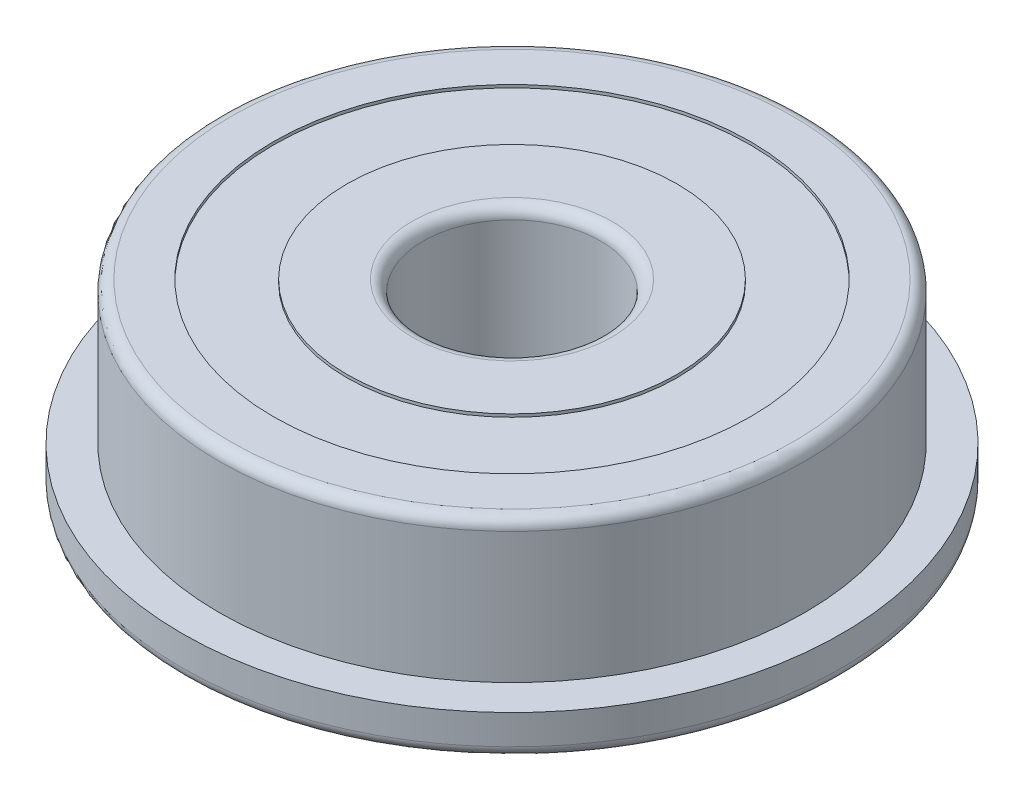
ISO-10303-21;
HEADER;
FILE_DESCRIPTION(('STEP AP214'),'2;1');
FILE_NAME('part.step','',(''),(''),'','','');
FILE_SCHEMA(('AUTOMOTIVE_DESIGN { 1 0 10303 214 1 1 1 1 }'));
ENDSEC;
DATA;
#1=APPLICATION_CONTEXT('core data for automotive mechanical design processes');
#2=APPLICATION_PROTOCOL_DEFINITION('international standard','automotive_design',2000,#1);
#3=PRODUCT_CONTEXT('',#1,'mechanical');
#4=PRODUCT('Part','Part','',(#3));
#5=PRODUCT_RELATED_PRODUCT_CATEGORY('part','',(#4));
#6=PRODUCT_DEFINITION_FORMATION('','',#4);
#7=PRODUCT_DEFINITION_CONTEXT('part definition',#1,'design');
#8=PRODUCT_DEFINITION('design','',#6,#7);
#9=PRODUCT_DEFINITION_SHAPE('','',#8);
#10=(LENGTH_UNIT() NAMED_UNIT(*) SI_UNIT(.MILLI.,.METRE.));
#11=(NAMED_UNIT(*) PLANE_ANGLE_UNIT() SI_UNIT($,.RADIAN.));
#12=(NAMED_UNIT(*) SI_UNIT($,.STERADIAN.) SOLID_ANGLE_UNIT());
#13=UNCERTAINTY_MEASURE_WITH_UNIT(LENGTH_MEASURE(1.E-05),#10,'distance_accuracy_value','');
#14=(GEOMETRIC_REPRESENTATION_CONTEXT(3) GLOBAL_UNCERTAINTY_ASSIGNED_CONTEXT((#13)) GLOBAL_UNIT_ASSIGNED_CONTEXT((#10,
#11,#12)) REPRESENTATION_CONTEXT('',''));
#15=CARTESIAN_POINT('',(0.,0.,0.));
#16=DIRECTION('',(0.,0.,1.));
#17=DIRECTION('',(1.,0.,0.));
#18=AXIS2_PLACEMENT_3D('',#15,#16,#17);
#19=CARTESIAN_POINT('',(0.,5.,0.));
#20=DIRECTION('',(0.,1.,0.));
#21=DIRECTION('',(0.,0.,1.));
#22=AXIS2_PLACEMENT_3D('',#19,#20,#21);
#23=PLANE('',#22);
#24=CARTESIAN_POINT('',(0.,5.,0.));
#25=DIRECTION('',(0.,1.,0.));
#26=DIRECTION('',(0.,0.,1.));
#27=AXIS2_PLACEMENT_3D('',#24,#25,#26);
#28=CIRCLE('',#27,2.73);
#29=CARTESIAN_POINT('',(0.,5.,2.73));
#30=VERTEX_POINT('',#29);
#31=EDGE_CURVE('E10',#30,#30,#28,.F.);
#32=ORIENTED_EDGE('',*,*,#31,.T.);
#33=EDGE_LOOP('',(#32));
#34=FACE_BOUND('',#33,.T.);
#35=CARTESIAN_POINT('',(0.,5.,0.));
#36=DIRECTION('',(0.,1.,0.));
#37=DIRECTION('',(0.,0.,1.));
#38=AXIS2_PLACEMENT_3D('',#35,#36,#37);
#39=CIRCLE('',#38,4.5);
#40=CARTESIAN_POINT('',(0.,5.,4.5));
#41=VERTEX_POINT('',#40);
#42=EDGE_CURVE('E94',#41,#41,#39,.T.);
#43=ORIENTED_EDGE('',*,*,#42,.T.);
#44=EDGE_LOOP('',(#43));
#45=FACE_BOUND('',#44,.T.);
#46=ADVANCED_FACE('F37',(#34,#45),#23,.T.);
#47=CARTESIAN_POINT('',(0.,0.,0.));
#48=DIRECTION('',(0.,1.,0.));
#49=DIRECTION('',(0.,0.,1.));
#50=AXIS2_PLACEMENT_3D('',#47,#48,#49);
#51=PLANE('',#50);
#52=CARTESIAN_POINT('',(0.,0.,0.));
#53=DIRECTION('',(0.,1.,0.));
#54=DIRECTION('',(0.,0.,1.));
#55=AXIS2_PLACEMENT_3D('',#52,#53,#54);
#56=CIRCLE('',#55,2.73);
#57=CARTESIAN_POINT('',(0.,0.,2.73));
#58=VERTEX_POINT('',#57);
#59=EDGE_CURVE('E66',#58,#58,#56,.T.);
#60=ORIENTED_EDGE('',*,*,#59,.T.);
#61=EDGE_LOOP('',(#60));
#62=FACE_BOUND('',#61,.T.);
#63=CARTESIAN_POINT('',(0.,0.,0.));
#64=DIRECTION('',(0.,-1.,0.));
#65=DIRECTION('',(0.,0.,-1.));
#66=AXIS2_PLACEMENT_3D('',#63,#64,#65);
#67=CIRCLE('',#66,4.5);
#68=CARTESIAN_POINT('',(0.,0.,-4.5));
#69=VERTEX_POINT('',#68);
#70=EDGE_CURVE('E82',#69,#69,#67,.T.);
#71=ORIENTED_EDGE('',*,*,#70,.T.);
#72=EDGE_LOOP('',(#71));
#73=FACE_BOUND('',#72,.T.);
#74=ADVANCED_FACE('F132',(#62,#73),#51,.F.);
#75=CARTESIAN_POINT('',(0.,1.12,0.));
#76=DIRECTION('',(0.,-1.,0.));
#77=DIRECTION('',(0.,0.,-1.));
#78=AXIS2_PLACEMENT_3D('',#75,#76,#77);
#79=CYLINDRICAL_SURFACE('',#78,8.985);
#80=CARTESIAN_POINT('',(0.,0.31,0.));
#81=DIRECTION('',(0.,1.,0.));
#82=DIRECTION('',(0.,0.,1.));
#83=AXIS2_PLACEMENT_3D('',#80,#81,#82);
#84=CIRCLE('',#83,8.985);
#85=CARTESIAN_POINT('',(0.,0.31,8.985));
#86=VERTEX_POINT('',#85);
#87=EDGE_CURVE('E57',#86,#86,#84,.T.);
#88=ORIENTED_EDGE('',*,*,#87,.T.);
#89=EDGE_LOOP('',(#88));
#90=FACE_BOUND('',#89,.T.);
#91=CARTESIAN_POINT('',(0.,1.12,0.));
#92=DIRECTION('',(0.,1.,0.));
#93=DIRECTION('',(0.,0.,1.));
#94=AXIS2_PLACEMENT_3D('',#91,#92,#93);
#95=CIRCLE('',#94,8.985);
#96=CARTESIAN_POINT('',(0.,1.12,8.985));
#97=VERTEX_POINT('',#96);
#98=EDGE_CURVE('E70',#97,#97,#95,.T.);
#99=ORIENTED_EDGE('',*,*,#98,.F.);
#100=EDGE_LOOP('',(#99));
#101=FACE_BOUND('',#100,.T.);
#102=ADVANCED_FACE('F136',(#90,#101),#79,.T.);
#103=CARTESIAN_POINT('',(0.,1.12,0.));
#104=DIRECTION('',(0.,1.,0.));
#105=DIRECTION('',(0.,0.,1.));
#106=AXIS2_PLACEMENT_3D('',#103,#104,#105);
#107=PLANE('',#106);
#108=CARTESIAN_POINT('',(0.,1.12,0.));
#109=DIRECTION('',(0.,1.,0.));
#110=DIRECTION('',(0.,0.,1.));
#111=AXIS2_PLACEMENT_3D('',#108,#109,#110);
#112=CIRCLE('',#111,7.985);
#113=CARTESIAN_POINT('',(0.,1.12,7.985));
#114=VERTEX_POINT('',#113);
#115=EDGE_CURVE('E69',#114,#114,#112,.T.);
#116=ORIENTED_EDGE('',*,*,#115,.F.);
#117=EDGE_LOOP('',(#116));
#118=FACE_BOUND('',#117,.T.);
#119=ORIENTED_EDGE('',*,*,#98,.T.);
#120=EDGE_LOOP('',(#119));
#121=FACE_BOUND('',#120,.T.);
#122=ADVANCED_FACE('F167',(#118,#121),#107,.T.);
#123=CARTESIAN_POINT('',(0.,0.,0.));
#124=DIRECTION('',(0.,1.,0.));
#125=DIRECTION('',(0.,0.,1.));
#126=AXIS2_PLACEMENT_3D('',#123,#124,#125);
#127=CIRCLE('',#126,8.675);
#128=CARTESIAN_POINT('',(0.,0.,8.675));
#129=VERTEX_POINT('',#128);
#130=EDGE_CURVE('E52',#129,#129,#127,.F.);
#131=ORIENTED_EDGE('',*,*,#130,.T.);
#132=EDGE_LOOP('',(#131));
#133=FACE_BOUND('',#132,.T.);
#134=CARTESIAN_POINT('',(0.,0.,0.));
#135=DIRECTION('',(0.,-1.,0.));
#136=DIRECTION('',(0.,0.,-1.));
#137=AXIS2_PLACEMENT_3D('',#134,#135,#136);
#138=CIRCLE('',#137,6.5);
#139=CARTESIAN_POINT('',(0.,0.,-6.5));
#140=VERTEX_POINT('',#139);
#141=EDGE_CURVE('E76',#140,#140,#138,.T.);
#142=ORIENTED_EDGE('',*,*,#141,.F.);
#143=EDGE_LOOP('',(#142));
#144=FACE_BOUND('',#143,.T.);
#145=ADVANCED_FACE('F129',(#133,#144),#51,.F.);
#146=CARTESIAN_POINT('',(0.,5.,0.));
#147=DIRECTION('',(0.,-1.,0.));
#148=DIRECTION('',(0.,0.,-1.));
#149=AXIS2_PLACEMENT_3D('',#146,#147,#148);
#150=CYLINDRICAL_SURFACE('',#149,7.985);
#151=CARTESIAN_POINT('',(0.,4.69,0.));
#152=DIRECTION('',(0.,1.,0.));
#153=DIRECTION('',(0.,0.,1.));
#154=AXIS2_PLACEMENT_3D('',#151,#152,#153);
#155=CIRCLE('',#154,7.985);
#156=CARTESIAN_POINT('',(0.,4.69,7.985));
#157=VERTEX_POINT('',#156);
#158=EDGE_CURVE('E44',#157,#157,#155,.F.);
#159=ORIENTED_EDGE('',*,*,#158,.T.);
#160=EDGE_LOOP('',(#159));
#161=FACE_BOUND('',#160,.T.);
#162=ORIENTED_EDGE('',*,*,#115,.T.);
#163=EDGE_LOOP('',(#162));
#164=FACE_BOUND('',#163,.T.);
#165=ADVANCED_FACE('F119',(#161,#164),#150,.T.);
#166=CARTESIAN_POINT('',(0.,5.,0.));
#167=DIRECTION('',(0.,1.,0.));
#168=DIRECTION('',(0.,0.,1.));
#169=AXIS2_PLACEMENT_3D('',#166,#167,#168);
#170=CIRCLE('',#169,7.675);
#171=CARTESIAN_POINT('',(0.,5.,7.675));
#172=VERTEX_POINT('',#171);
#173=EDGE_CURVE('E48',#172,#172,#170,.T.);
#174=ORIENTED_EDGE('',*,*,#173,.T.);
#175=EDGE_LOOP('',(#174));
#176=FACE_BOUND('',#175,.T.);
#177=CARTESIAN_POINT('',(0.,5.,0.));
#178=DIRECTION('',(0.,1.,0.));
#179=DIRECTION('',(0.,0.,1.));
#180=AXIS2_PLACEMENT_3D('',#177,#178,#179);
#181=CIRCLE('',#180,6.5);
#182=CARTESIAN_POINT('',(0.,5.,6.5));
#183=VERTEX_POINT('',#182);
#184=EDGE_CURVE('E88',#183,#183,#181,.T.);
#185=ORIENTED_EDGE('',*,*,#184,.F.);
#186=EDGE_LOOP('',(#185));
#187=FACE_BOUND('',#186,.T.);
#188=ADVANCED_FACE('F116',(#176,#187),#23,.T.);
#189=CARTESIAN_POINT('',(0.,0.,0.));
#190=DIRECTION('',(0.,1.,0.));
#191=DIRECTION('',(0.,0.,1.));
#192=AXIS2_PLACEMENT_3D('',#189,#190,#191);
#193=CYLINDRICAL_SURFACE('',#192,2.42);
#194=CARTESIAN_POINT('',(0.,0.31,0.));
#195=DIRECTION('',(0.,1.,0.));
#196=DIRECTION('',(0.,0.,1.));
#197=AXIS2_PLACEMENT_3D('',#194,#195,#196);
#198=CIRCLE('',#197,2.42);
#199=CARTESIAN_POINT('',(0.,0.31,2.42));
#200=VERTEX_POINT('',#199);
#201=EDGE_CURVE('E60',#200,#200,#198,.F.);
#202=ORIENTED_EDGE('',*,*,#201,.T.);
#203=EDGE_LOOP('',(#202));
#204=FACE_BOUND('',#203,.T.);
#205=CARTESIAN_POINT('',(0.,4.69,0.));
#206=DIRECTION('',(0.,1.,0.));
#207=DIRECTION('',(0.,0.,1.));
#208=AXIS2_PLACEMENT_3D('',#205,#206,#207);
#209=CIRCLE('',#208,2.42);
#210=CARTESIAN_POINT('',(0.,4.69,2.42));
#211=VERTEX_POINT('',#210);
#212=EDGE_CURVE('E63',#211,#211,#209,.T.);
#213=ORIENTED_EDGE('',*,*,#212,.T.);
#214=EDGE_LOOP('',(#213));
#215=FACE_BOUND('',#214,.T.);
#216=ADVANCED_FACE('F118',(#204,#215),#193,.F.);
#217=CARTESIAN_POINT('',(0.,0.08,0.));
#218=DIRECTION('',(0.,-1.,0.));
#219=DIRECTION('',(0.,0.,-1.));
#220=AXIS2_PLACEMENT_3D('',#217,#218,#219);
#221=CYLINDRICAL_SURFACE('',#220,6.5);
#222=CARTESIAN_POINT('',(0.,0.08,0.));
#223=DIRECTION('',(0.,-1.,0.));
#224=DIRECTION('',(0.,0.,-1.));
#225=AXIS2_PLACEMENT_3D('',#222,#223,#224);
#226=CIRCLE('',#225,6.5);
#227=CARTESIAN_POINT('',(0.,0.08,-6.5));
#228=VERTEX_POINT('',#227);
#229=EDGE_CURVE('E73',#228,#228,#226,.T.);
#230=CARTESIAN_POINT('',(0.,0.08,-6.5));
#231=CARTESIAN_POINT('',(0.,0.0791666666666667,-6.5));
#232=CARTESIAN_POINT('',(0.,0.0783333333333333,-6.5));
#233=CARTESIAN_POINT('',(0.,0.0766666666666667,-6.5));
#234=CARTESIAN_POINT('',(0.,0.0758333333333333,-6.5));
#235=CARTESIAN_POINT('',(0.,0.0741666666666667,-6.5));
#236=CARTESIAN_POINT('',(0.,0.0733333333333333,-6.5));
#237=CARTESIAN_POINT('',(0.,0.0716666666666667,-6.5));
#238=CARTESIAN_POINT('',(0.,0.0708333333333333,-6.5));
#239=CARTESIAN_POINT('',(0.,0.0691666666666667,-6.5));
#240=CARTESIAN_POINT('',(0.,0.0683333333333333,-6.5));
#241=CARTESIAN_POINT('',(0.,0.0666666666666667,-6.5));
#242=CARTESIAN_POINT('',(0.,0.0658333333333333,-6.5));
#243=CARTESIAN_POINT('',(0.,0.0641666666666667,-6.5));
#244=CARTESIAN_POINT('',(0.,0.0633333333333333,-6.5));
#245=CARTESIAN_POINT('',(0.,0.0616666666666667,-6.5));
#246=CARTESIAN_POINT('',(0.,0.0608333333333333,-6.5));
#247=CARTESIAN_POINT('',(0.,0.0591666666666667,-6.5));
#248=CARTESIAN_POINT('',(0.,0.0583333333333333,-6.5));
#249=CARTESIAN_POINT('',(0.,0.0566666666666667,-6.5));
#250=CARTESIAN_POINT('',(0.,0.0558333333333333,-6.5));
#251=CARTESIAN_POINT('',(0.,0.0541666666666667,-6.5));
#252=CARTESIAN_POINT('',(0.,0.0533333333333333,-6.5));
#253=CARTESIAN_POINT('',(0.,0.0516666666666667,-6.5));
#254=CARTESIAN_POINT('',(0.,0.0508333333333333,-6.5));
#255=CARTESIAN_POINT('',(0.,0.0491666666666667,-6.5));
#256=CARTESIAN_POINT('',(0.,0.0483333333333333,-6.5));
#257=CARTESIAN_POINT('',(0.,0.0466666666666667,-6.5));
#258=CARTESIAN_POINT('',(0.,0.0458333333333333,-6.5));
#259=CARTESIAN_POINT('',(0.,0.0441666666666667,-6.5));
#260=CARTESIAN_POINT('',(0.,0.0433333333333333,-6.5));
#261=CARTESIAN_POINT('',(0.,0.0416666666666667,-6.5));
#262=CARTESIAN_POINT('',(0.,0.0408333333333333,-6.5));
#263=CARTESIAN_POINT('',(0.,0.0391666666666667,-6.5));
#264=CARTESIAN_POINT('',(0.,0.0383333333333333,-6.5));
#265=CARTESIAN_POINT('',(0.,0.0366666666666667,-6.5));
#266=CARTESIAN_POINT('',(0.,0.0358333333333333,-6.5));
#267=CARTESIAN_POINT('',(0.,0.0341666666666667,-6.5));
#268=CARTESIAN_POINT('',(0.,0.0333333333333333,-6.5));
#269=CARTESIAN_POINT('',(0.,0.0316666666666667,-6.5));
#270=CARTESIAN_POINT('',(0.,0.0308333333333333,-6.5));
#271=CARTESIAN_POINT('',(0.,0.0291666666666667,-6.5));
#272=CARTESIAN_POINT('',(0.,0.0283333333333333,-6.5));
#273=CARTESIAN_POINT('',(0.,0.0266666666666667,-6.5));
#274=CARTESIAN_POINT('',(0.,0.0258333333333333,-6.5));
#275=CARTESIAN_POINT('',(0.,0.0241666666666667,-6.5));
#276=CARTESIAN_POINT('',(0.,0.0233333333333333,-6.5));
#277=CARTESIAN_POINT('',(0.,0.0216666666666667,-6.5));
#278=CARTESIAN_POINT('',(0.,0.0208333333333333,-6.5));
#279=CARTESIAN_POINT('',(0.,0.0191666666666667,-6.5));
#280=CARTESIAN_POINT('',(0.,0.0183333333333333,-6.5));
#281=CARTESIAN_POINT('',(0.,0.0166666666666667,-6.5));
#282=CARTESIAN_POINT('',(0.,0.0158333333333333,-6.5));
#283=CARTESIAN_POINT('',(0.,0.0141666666666667,-6.5));
#284=CARTESIAN_POINT('',(0.,0.0133333333333333,-6.5));
#285=CARTESIAN_POINT('',(0.,0.0116666666666667,-6.5));
#286=CARTESIAN_POINT('',(0.,0.0108333333333333,-6.5));
#287=CARTESIAN_POINT('',(0.,0.00916666666666667,-6.5));
#288=CARTESIAN_POINT('',(0.,0.00833333333333334,-6.5));
#289=CARTESIAN_POINT('',(0.,0.00666666666666667,-6.5));
#290=CARTESIAN_POINT('',(0.,0.00583333333333333,-6.5));
#291=CARTESIAN_POINT('',(0.,0.00416666666666667,-6.5));
#292=CARTESIAN_POINT('',(0.,0.00333333333333334,-6.5));
#293=CARTESIAN_POINT('',(0.,0.00166666666666667,-6.5));
#294=CARTESIAN_POINT('',(0.,0.000833333333333335,-6.5));
#295=CARTESIAN_POINT('',(0.,0.,-6.5));
#296=B_SPLINE_CURVE_WITH_KNOTS('',3,(#230,#231,#232,#233,#234,#235,#236,#237,#238,#239,#240,
#241,#242,#243,#244,#245,#246,#247,#248,#249,#250,#251,#252,#253,#254,#255,#256,#257,#258,#259,
#260,#261,#262,#263,#264,#265,#266,#267,#268,#269,#270,#271,#272,#273,#274,#275,#276,#277,#278,
#279,#280,#281,#282,#283,#284,#285,#286,#287,#288,#289,#290,#291,#292,#293,#294,#295),
.UNSPECIFIED.,.F.,.F.,(4,2,2,2,2,2,2,2,2,2,2,2,2,2,2,2,2,2,2,2,2,2,2,2,2,2,2,2,2,2,2,2,4),(0.,
0.00250000000000001,0.00500000000000001,0.00750000000000001,0.01,0.0125,0.015,0.0175,0.02,
0.0225,0.025,0.0275,0.03,0.0325,0.035,0.0375,0.04,0.0425,0.045,0.0475,0.05,0.0525,0.055,0.0575,
0.06,0.0625,0.065,0.0675,0.07,0.0725,0.075,0.0775,0.08),.UNSPECIFIED.);
#297=EDGE_CURVE('BSEAM126',#228,#140,#296,.T.);
#298=ORIENTED_EDGE('',*,*,#229,.F.);
#299=ORIENTED_EDGE('',*,*,#141,.T.);
#300=ORIENTED_EDGE('',*,*,#297,.T.);
#301=ORIENTED_EDGE('',*,*,#297,.F.);
#302=EDGE_LOOP('',(#298,#300,#299,#301));
#303=FACE_BOUND('',#302,.T.);
#304=ADVANCED_FACE('F126',(#303),#221,.F.);
#305=CARTESIAN_POINT('',(0.,0.08,0.));
#306=DIRECTION('',(0.,-1.,0.));
#307=DIRECTION('',(0.,0.,-1.));
#308=AXIS2_PLACEMENT_3D('',#305,#306,#307);
#309=PLANE('',#308);
#310=CARTESIAN_POINT('',(0.,0.08,0.));
#311=DIRECTION('',(0.,-1.,0.));
#312=DIRECTION('',(0.,0.,-1.));
#313=AXIS2_PLACEMENT_3D('',#310,#311,#312);
#314=CIRCLE('',#313,4.5);
#315=CARTESIAN_POINT('',(0.,0.08,-4.5));
#316=VERTEX_POINT('',#315);
#317=EDGE_CURVE('E79',#316,#316,#314,.T.);
#318=ORIENTED_EDGE('',*,*,#317,.F.);
#319=EDGE_LOOP('',(#318));
#320=FACE_BOUND('',#319,.T.);
#321=ORIENTED_EDGE('',*,*,#229,.T.);
#322=EDGE_LOOP('',(#321));
#323=FACE_BOUND('',#322,.T.);
#324=ADVANCED_FACE('F153',(#320,#323),#309,.T.);
#325=CARTESIAN_POINT('',(0.,0.08,0.));
#326=DIRECTION('',(0.,-1.,0.));
#327=DIRECTION('',(0.,0.,-1.));
#328=AXIS2_PLACEMENT_3D('',#325,#326,#327);
#329=CYLINDRICAL_SURFACE('',#328,4.5);
#330=CARTESIAN_POINT('',(0.,0.08,-4.5));
#331=CARTESIAN_POINT('',(0.,0.0791666666666667,-4.5));
#332=CARTESIAN_POINT('',(0.,0.0783333333333333,-4.5));
#333=CARTESIAN_POINT('',(0.,0.0766666666666667,-4.5));
#334=CARTESIAN_POINT('',(0.,0.0758333333333333,-4.5));
#335=CARTESIAN_POINT('',(0.,0.0741666666666667,-4.5));
#336=CARTESIAN_POINT('',(0.,0.0733333333333333,-4.5));
#337=CARTESIAN_POINT('',(0.,0.0716666666666667,-4.5));
#338=CARTESIAN_POINT('',(0.,0.0708333333333333,-4.5));
#339=CARTESIAN_POINT('',(0.,0.0691666666666667,-4.5));
#340=CARTESIAN_POINT('',(0.,0.0683333333333333,-4.5));
#341=CARTESIAN_POINT('',(0.,0.0666666666666667,-4.5));
#342=CARTESIAN_POINT('',(0.,0.0658333333333333,-4.5));
#343=CARTESIAN_POINT('',(0.,0.0641666666666667,-4.5));
#344=CARTESIAN_POINT('',(0.,0.0633333333333334,-4.5));
#345=CARTESIAN_POINT('',(0.,0.0616666666666667,-4.5));
#346=CARTESIAN_POINT('',(0.,0.0608333333333333,-4.5));
#347=CARTESIAN_POINT('',(0.,0.0591666666666667,-4.5));
#348=CARTESIAN_POINT('',(0.,0.0583333333333333,-4.5));
#349=CARTESIAN_POINT('',(0.,0.0566666666666667,-4.5));
#350=CARTESIAN_POINT('',(0.,0.0558333333333333,-4.5));
#351=CARTESIAN_POINT('',(0.,0.0541666666666667,-4.5));
#352=CARTESIAN_POINT('',(0.,0.0533333333333333,-4.5));
#353=CARTESIAN_POINT('',(0.,0.0516666666666667,-4.5));
#354=CARTESIAN_POINT('',(0.,0.0508333333333333,-4.5));
#355=CARTESIAN_POINT('',(0.,0.0491666666666667,-4.5));
#356=CARTESIAN_POINT('',(0.,0.0483333333333333,-4.5));
#357=CARTESIAN_POINT('',(0.,0.0466666666666667,-4.5));
#358=CARTESIAN_POINT('',(0.,0.0458333333333333,-4.5));
#359=CARTESIAN_POINT('',(0.,0.0441666666666667,-4.5));
#360=CARTESIAN_POINT('',(0.,0.0433333333333333,-4.5));
#361=CARTESIAN_POINT('',(0.,0.0416666666666667,-4.5));
#362=CARTESIAN_POINT('',(0.,0.0408333333333333,-4.5));
#363=CARTESIAN_POINT('',(0.,0.0391666666666667,-4.5));
#364=CARTESIAN_POINT('',(0.,0.0383333333333333,-4.5));
#365=CARTESIAN_POINT('',(0.,0.0366666666666667,-4.5));
#366=CARTESIAN_POINT('',(0.,0.0358333333333333,-4.5));
#367=CARTESIAN_POINT('',(0.,0.0341666666666667,-4.5));
#368=CARTESIAN_POINT('',(0.,0.0333333333333333,-4.5));
#369=CARTESIAN_POINT('',(0.,0.0316666666666667,-4.5));
#370=CARTESIAN_POINT('',(0.,0.0308333333333333,-4.5));
#371=CARTESIAN_POINT('',(0.,0.0291666666666667,-4.5));
#372=CARTESIAN_POINT('',(0.,0.0283333333333333,-4.5));
#373=CARTESIAN_POINT('',(0.,0.0266666666666667,-4.5));
#374=CARTESIAN_POINT('',(0.,0.0258333333333333,-4.5));
#375=CARTESIAN_POINT('',(0.,0.0241666666666667,-4.5));
#376=CARTESIAN_POINT('',(0.,0.0233333333333333,-4.5));
#377=CARTESIAN_POINT('',(0.,0.0216666666666667,-4.5));
#378=CARTESIAN_POINT('',(0.,0.0208333333333333,-4.5));
#379=CARTESIAN_POINT('',(0.,0.0191666666666667,-4.5));
#380=CARTESIAN_POINT('',(0.,0.0183333333333333,-4.5));
#381=CARTESIAN_POINT('',(0.,0.0166666666666667,-4.5));
#382=CARTESIAN_POINT('',(0.,0.0158333333333333,-4.5));
#383=CARTESIAN_POINT('',(0.,0.0141666666666667,-4.5));
#384=CARTESIAN_POINT('',(0.,0.0133333333333333,-4.5));
#385=CARTESIAN_POINT('',(0.,0.0116666666666667,-4.5));
#386=CARTESIAN_POINT('',(0.,0.0108333333333333,-4.5));
#387=CARTESIAN_POINT('',(0.,0.00916666666666667,-4.5));
#388=CARTESIAN_POINT('',(0.,0.00833333333333334,-4.5));
#389=CARTESIAN_POINT('',(0.,0.00666666666666667,-4.5));
#390=CARTESIAN_POINT('',(0.,0.00583333333333333,-4.5));
#391=CARTESIAN_POINT('',(0.,0.00416666666666667,-4.5));
#392=CARTESIAN_POINT('',(0.,0.00333333333333334,-4.5));
#393=CARTESIAN_POINT('',(0.,0.00166666666666667,-4.5));
#394=CARTESIAN_POINT('',(0.,0.000833333333333335,-4.5));
#395=CARTESIAN_POINT('',(0.,0.,-4.5));
#396=B_SPLINE_CURVE_WITH_KNOTS('',3,(#330,#331,#332,#333,#334,#335,#336,#337,#338,#339,#340,
#341,#342,#343,#344,#345,#346,#347,#348,#349,#350,#351,#352,#353,#354,#355,#356,#357,#358,#359,
#360,#361,#362,#363,#364,#365,#366,#367,#368,#369,#370,#371,#372,#373,#374,#375,#376,#377,#378,
#379,#380,#381,#382,#383,#384,#385,#386,#387,#388,#389,#390,#391,#392,#393,#394,#395),
.UNSPECIFIED.,.F.,.F.,(4,2,2,2,2,2,2,2,2,2,2,2,2,2,2,2,2,2,2,2,2,2,2,2,2,2,2,2,2,2,2,2,4),(0.,
0.00249999999999999,0.005,0.00749999999999999,0.01,0.0125,0.015,0.0175,0.02,0.0225,0.025,0.0275,
0.03,0.0325,0.035,0.0375,0.04,0.0425,0.045,0.0475,0.05,0.0525,0.055,0.0575,0.06,0.0625,0.065,
0.0675,0.07,0.0725,0.075,0.0775,0.08),.UNSPECIFIED.);
#397=EDGE_CURVE('BSEAM112',#316,#69,#396,.T.);
#398=ORIENTED_EDGE('',*,*,#317,.T.);
#399=ORIENTED_EDGE('',*,*,#70,.F.);
#400=ORIENTED_EDGE('',*,*,#397,.T.);
#401=ORIENTED_EDGE('',*,*,#397,.F.);
#402=EDGE_LOOP('',(#398,#400,#399,#401));
#403=FACE_BOUND('',#402,.T.);
#404=ADVANCED_FACE('F112',(#403),#329,.T.);
#405=CARTESIAN_POINT('',(0.,4.92,0.));
#406=DIRECTION('',(0.,1.,0.));
#407=DIRECTION('',(0.,0.,1.));
#408=AXIS2_PLACEMENT_3D('',#405,#406,#407);
#409=CYLINDRICAL_SURFACE('',#408,6.5);
#410=CARTESIAN_POINT('',(0.,4.92,0.));
#411=DIRECTION('',(0.,1.,0.));
#412=DIRECTION('',(0.,0.,1.));
#413=AXIS2_PLACEMENT_3D('',#410,#411,#412);
#414=CIRCLE('',#413,6.5);
#415=CARTESIAN_POINT('',(0.,4.92,6.5));
#416=VERTEX_POINT('',#415);
#417=EDGE_CURVE('E85',#416,#416,#414,.T.);
#418=CARTESIAN_POINT('',(0.,4.92,6.5));
#419=CARTESIAN_POINT('',(0.,4.92083333333333,6.5));
#420=CARTESIAN_POINT('',(0.,4.92166666666667,6.5));
#421=CARTESIAN_POINT('',(0.,4.92333333333333,6.5));
#422=CARTESIAN_POINT('',(0.,4.92416666666667,6.5));
#423=CARTESIAN_POINT('',(0.,4.92583333333333,6.5));
#424=CARTESIAN_POINT('',(0.,4.92666666666667,6.5));
#425=CARTESIAN_POINT('',(0.,4.92833333333333,6.5));
#426=CARTESIAN_POINT('',(0.,4.92916666666667,6.5));
#427=CARTESIAN_POINT('',(0.,4.93083333333333,6.5));
#428=CARTESIAN_POINT('',(0.,4.93166666666667,6.5));
#429=CARTESIAN_POINT('',(0.,4.93333333333333,6.5));
#430=CARTESIAN_POINT('',(0.,4.93416666666667,6.5));
#431=CARTESIAN_POINT('',(0.,4.93583333333333,6.5));
#432=CARTESIAN_POINT('',(0.,4.93666666666667,6.5));
#433=CARTESIAN_POINT('',(0.,4.93833333333333,6.5));
#434=CARTESIAN_POINT('',(0.,4.93916666666667,6.5));
#435=CARTESIAN_POINT('',(0.,4.94083333333333,6.5));
#436=CARTESIAN_POINT('',(0.,4.94166666666667,6.5));
#437=CARTESIAN_POINT('',(0.,4.94333333333333,6.5));
#438=CARTESIAN_POINT('',(0.,4.94416666666667,6.5));
#439=CARTESIAN_POINT('',(0.,4.94583333333333,6.5));
#440=CARTESIAN_POINT('',(0.,4.94666666666667,6.5));
#441=CARTESIAN_POINT('',(0.,4.94833333333333,6.5));
#442=CARTESIAN_POINT('',(0.,4.94916666666667,6.5));
#443=CARTESIAN_POINT('',(0.,4.95083333333333,6.5));
#444=CARTESIAN_POINT('',(0.,4.95166666666667,6.5));
#445=CARTESIAN_POINT('',(0.,4.95333333333333,6.5));
#446=CARTESIAN_POINT('',(0.,4.95416666666667,6.5));
#447=CARTESIAN_POINT('',(0.,4.95583333333333,6.5));
#448=CARTESIAN_POINT('',(0.,4.95666666666667,6.5));
#449=CARTESIAN_POINT('',(0.,4.95833333333333,6.5));
#450=CARTESIAN_POINT('',(0.,4.95916666666667,6.5));
#451=CARTESIAN_POINT('',(0.,4.96083333333333,6.5));
#452=CARTESIAN_POINT('',(0.,4.96166666666667,6.5));
#453=CARTESIAN_POINT('',(0.,4.96333333333333,6.5));
#454=CARTESIAN_POINT('',(0.,4.96416666666667,6.5));
#455=CARTESIAN_POINT('',(0.,4.96583333333333,6.5));
#456=CARTESIAN_POINT('',(0.,4.96666666666667,6.5));
#457=CARTESIAN_POINT('',(0.,4.96833333333333,6.5));
#458=CARTESIAN_POINT('',(0.,4.96916666666667,6.5));
#459=CARTESIAN_POINT('',(0.,4.97083333333333,6.5));
#460=CARTESIAN_POINT('',(0.,4.97166666666667,6.5));
#461=CARTESIAN_POINT('',(0.,4.97333333333333,6.5));
#462=CARTESIAN_POINT('',(0.,4.97416666666667,6.5));
#463=CARTESIAN_POINT('',(0.,4.97583333333333,6.5));
#464=CARTESIAN_POINT('',(0.,4.97666666666667,6.5));
#465=CARTESIAN_POINT('',(0.,4.97833333333333,6.5));
#466=CARTESIAN_POINT('',(0.,4.97916666666667,6.5));
#467=CARTESIAN_POINT('',(0.,4.98083333333333,6.5));
#468=CARTESIAN_POINT('',(0.,4.98166666666667,6.5));
#469=CARTESIAN_POINT('',(0.,4.98333333333333,6.5));
#470=CARTESIAN_POINT('',(0.,4.98416666666667,6.5));
#471=CARTESIAN_POINT('',(0.,4.98583333333333,6.5));
#472=CARTESIAN_POINT('',(0.,4.98666666666667,6.5));
#473=CARTESIAN_POINT('',(0.,4.98833333333333,6.5));
#474=CARTESIAN_POINT('',(0.,4.98916666666667,6.5));
#475=CARTESIAN_POINT('',(0.,4.99083333333333,6.5));
#476=CARTESIAN_POINT('',(0.,4.99166666666667,6.5));
#477=CARTESIAN_POINT('',(0.,4.99333333333333,6.5));
#478=CARTESIAN_POINT('',(0.,4.99416666666667,6.5));
#479=CARTESIAN_POINT('',(0.,4.99583333333333,6.5));
#480=CARTESIAN_POINT('',(0.,4.99666666666667,6.5));
#481=CARTESIAN_POINT('',(0.,4.99833333333333,6.5));
#482=CARTESIAN_POINT('',(0.,4.99916666666667,6.5));
#483=CARTESIAN_POINT('',(0.,5.,6.5));
#484=B_SPLINE_CURVE_WITH_KNOTS('',3,(#418,#419,#420,#421,#422,#423,#424,#425,#426,#427,#428,
#429,#430,#431,#432,#433,#434,#435,#436,#437,#438,#439,#440,#441,#442,#443,#444,#445,#446,#447,
#448,#449,#450,#451,#452,#453,#454,#455,#456,#457,#458,#459,#460,#461,#462,#463,#464,#465,#466,
#467,#468,#469,#470,#471,#472,#473,#474,#475,#476,#477,#478,#479,#480,#481,#482,#483),
.UNSPECIFIED.,.F.,.F.,(4,2,2,2,2,2,2,2,2,2,2,2,2,2,2,2,2,2,2,2,2,2,2,2,2,2,2,2,2,2,2,2,4),(0.,
0.0024999999999999,0.0049999999999998,0.00749999999999969,0.00999999999999959,
0.0124999999999995,0.0149999999999994,0.0174999999999993,0.0200000000000001,0.0225,
0.0249999999999998,0.0274999999999997,0.0299999999999996,0.0324999999999995,0.0349999999999994,
0.0374999999999993,0.0400000000000001,0.0425,0.0449999999999999,0.0474999999999998,
0.0499999999999997,0.0524999999999996,0.0549999999999995,0.0574999999999994,0.0600000000000002,
0.0625000000000001,0.0649999999999999,0.0674999999999999,0.0699999999999998,0.0724999999999996,
0.0749999999999995,0.0774999999999994,0.0800000000000002),.UNSPECIFIED.);
#485=EDGE_CURVE('BSEAM106',#416,#183,#484,.T.);
#486=ORIENTED_EDGE('',*,*,#417,.F.);
#487=ORIENTED_EDGE('',*,*,#184,.T.);
#488=ORIENTED_EDGE('',*,*,#485,.T.);
#489=ORIENTED_EDGE('',*,*,#485,.F.);
#490=EDGE_LOOP('',(#486,#488,#487,#489));
#491=FACE_BOUND('',#490,.T.);
#492=ADVANCED_FACE('F106',(#491),#409,.F.);
#493=CARTESIAN_POINT('',(0.,4.92,0.));
#494=DIRECTION('',(0.,1.,0.));
#495=DIRECTION('',(0.,0.,1.));
#496=AXIS2_PLACEMENT_3D('',#493,#494,#495);
#497=PLANE('',#496);
#498=CARTESIAN_POINT('',(0.,4.92,0.));
#499=DIRECTION('',(0.,1.,0.));
#500=DIRECTION('',(0.,0.,1.));
#501=AXIS2_PLACEMENT_3D('',#498,#499,#500);
#502=CIRCLE('',#501,4.5);
#503=CARTESIAN_POINT('',(0.,4.92,4.5));
#504=VERTEX_POINT('',#503);
#505=EDGE_CURVE('E91',#504,#504,#502,.T.);
#506=ORIENTED_EDGE('',*,*,#505,.F.);
#507=EDGE_LOOP('',(#506));
#508=FACE_BOUND('',#507,.T.);
#509=ORIENTED_EDGE('',*,*,#417,.T.);
#510=EDGE_LOOP('',(#509));
#511=FACE_BOUND('',#510,.T.);
#512=ADVANCED_FACE('F103',(#508,#511),#497,.T.);
#513=CARTESIAN_POINT('',(0.,4.92,0.));
#514=DIRECTION('',(0.,1.,0.));
#515=DIRECTION('',(0.,0.,1.));
#516=AXIS2_PLACEMENT_3D('',#513,#514,#515);
#517=CYLINDRICAL_SURFACE('',#516,4.5);
#518=CARTESIAN_POINT('',(0.,4.92,4.5));
#519=CARTESIAN_POINT('',(0.,4.92083333333333,4.5));
#520=CARTESIAN_POINT('',(0.,4.92166666666667,4.5));
#521=CARTESIAN_POINT('',(0.,4.92333333333333,4.5));
#522=CARTESIAN_POINT('',(0.,4.92416666666667,4.5));
#523=CARTESIAN_POINT('',(0.,4.92583333333333,4.5));
#524=CARTESIAN_POINT('',(0.,4.92666666666667,4.5));
#525=CARTESIAN_POINT('',(0.,4.92833333333333,4.5));
#526=CARTESIAN_POINT('',(0.,4.92916666666667,4.5));
#527=CARTESIAN_POINT('',(0.,4.93083333333333,4.5));
#528=CARTESIAN_POINT('',(0.,4.93166666666667,4.5));
#529=CARTESIAN_POINT('',(0.,4.93333333333333,4.5));
#530=CARTESIAN_POINT('',(0.,4.93416666666667,4.5));
#531=CARTESIAN_POINT('',(0.,4.93583333333333,4.5));
#532=CARTESIAN_POINT('',(0.,4.93666666666667,4.5));
#533=CARTESIAN_POINT('',(0.,4.93833333333333,4.5));
#534=CARTESIAN_POINT('',(0.,4.93916666666667,4.5));
#535=CARTESIAN_POINT('',(0.,4.94083333333333,4.5));
#536=CARTESIAN_POINT('',(0.,4.94166666666667,4.5));
#537=CARTESIAN_POINT('',(0.,4.94333333333333,4.5));
#538=CARTESIAN_POINT('',(0.,4.94416666666667,4.5));
#539=CARTESIAN_POINT('',(0.,4.94583333333333,4.5));
#540=CARTESIAN_POINT('',(0.,4.94666666666667,4.5));
#541=CARTESIAN_POINT('',(0.,4.94833333333333,4.5));
#542=CARTESIAN_POINT('',(0.,4.94916666666667,4.5));
#543=CARTESIAN_POINT('',(0.,4.95083333333333,4.5));
#544=CARTESIAN_POINT('',(0.,4.95166666666667,4.5));
#545=CARTESIAN_POINT('',(0.,4.95333333333333,4.5));
#546=CARTESIAN_POINT('',(0.,4.95416666666667,4.5));
#547=CARTESIAN_POINT('',(0.,4.95583333333333,4.5));
#548=CARTESIAN_POINT('',(0.,4.95666666666667,4.5));
#549=CARTESIAN_POINT('',(0.,4.95833333333333,4.5));
#550=CARTESIAN_POINT('',(0.,4.95916666666667,4.5));
#551=CARTESIAN_POINT('',(0.,4.96083333333333,4.5));
#552=CARTESIAN_POINT('',(0.,4.96166666666667,4.5));
#553=CARTESIAN_POINT('',(0.,4.96333333333333,4.5));
#554=CARTESIAN_POINT('',(0.,4.96416666666667,4.5));
#555=CARTESIAN_POINT('',(0.,4.96583333333333,4.5));
#556=CARTESIAN_POINT('',(0.,4.96666666666667,4.5));
#557=CARTESIAN_POINT('',(0.,4.96833333333333,4.5));
#558=CARTESIAN_POINT('',(0.,4.96916666666667,4.5));
#559=CARTESIAN_POINT('',(0.,4.97083333333333,4.5));
#560=CARTESIAN_POINT('',(0.,4.97166666666667,4.5));
#561=CARTESIAN_POINT('',(0.,4.97333333333333,4.5));
#562=CARTESIAN_POINT('',(0.,4.97416666666667,4.5));
#563=CARTESIAN_POINT('',(0.,4.97583333333333,4.5));
#564=CARTESIAN_POINT('',(0.,4.97666666666667,4.5));
#565=CARTESIAN_POINT('',(0.,4.97833333333333,4.5));
#566=CARTESIAN_POINT('',(0.,4.97916666666667,4.5));
#567=CARTESIAN_POINT('',(0.,4.98083333333333,4.5));
#568=CARTESIAN_POINT('',(0.,4.98166666666667,4.5));
#569=CARTESIAN_POINT('',(0.,4.98333333333333,4.5));
#570=CARTESIAN_POINT('',(0.,4.98416666666667,4.5));
#571=CARTESIAN_POINT('',(0.,4.98583333333333,4.5));
#572=CARTESIAN_POINT('',(0.,4.98666666666667,4.5));
#573=CARTESIAN_POINT('',(0.,4.98833333333333,4.5));
#574=CARTESIAN_POINT('',(0.,4.98916666666667,4.5));
#575=CARTESIAN_POINT('',(0.,4.99083333333333,4.5));
#576=CARTESIAN_POINT('',(0.,4.99166666666667,4.5));
#577=CARTESIAN_POINT('',(0.,4.99333333333333,4.5));
#578=CARTESIAN_POINT('',(0.,4.99416666666667,4.5));
#579=CARTESIAN_POINT('',(0.,4.99583333333333,4.5));
#580=CARTESIAN_POINT('',(0.,4.99666666666667,4.5));
#581=CARTESIAN_POINT('',(0.,4.99833333333333,4.5));
#582=CARTESIAN_POINT('',(0.,4.99916666666667,4.5));
#583=CARTESIAN_POINT('',(0.,5.,4.5));
#584=B_SPLINE_CURVE_WITH_KNOTS('',3,(#518,#519,#520,#521,#522,#523,#524,#525,#526,#527,#528,
#529,#530,#531,#532,#533,#534,#535,#536,#537,#538,#539,#540,#541,#542,#543,#544,#545,#546,#547,
#548,#549,#550,#551,#552,#553,#554,#555,#556,#557,#558,#559,#560,#561,#562,#563,#564,#565,#566,
#567,#568,#569,#570,#571,#572,#573,#574,#575,#576,#577,#578,#579,#580,#581,#582,#583),
.UNSPECIFIED.,.F.,.F.,(4,2,2,2,2,2,2,2,2,2,2,2,2,2,2,2,2,2,2,2,2,2,2,2,2,2,2,2,2,2,2,2,4),(0.,
0.00250000000000077,0.00500000000000066,0.00750000000000056,0.0100000000000005,
0.0125000000000004,0.0150000000000003,0.0175000000000002,0.0200000000000009,0.0225000000000008,
0.0250000000000007,0.0275000000000006,0.0300000000000005,0.0325000000000004,0.0350000000000003,
0.0375000000000002,0.040000000000001,0.0425000000000009,0.0450000000000008,0.0475000000000007,
0.0500000000000006,0.0525000000000005,0.0550000000000004,0.0575000000000003,0.060000000000001,
0.0625000000000009,0.0650000000000008,0.0675000000000007,0.0700000000000006,0.0725000000000005,
0.0750000000000004,0.0775000000000003,0.0800000000000011),.UNSPECIFIED.);
#585=EDGE_CURVE('BSEAM100',#504,#41,#584,.T.);
#586=ORIENTED_EDGE('',*,*,#505,.T.);
#587=ORIENTED_EDGE('',*,*,#42,.F.);
#588=ORIENTED_EDGE('',*,*,#585,.T.);
#589=ORIENTED_EDGE('',*,*,#585,.F.);
#590=EDGE_LOOP('',(#586,#588,#587,#589));
#591=FACE_BOUND('',#590,.T.);
#592=ADVANCED_FACE('F100',(#591),#517,.T.);
#593=CARTESIAN_POINT('',(0.,0.31,0.));
#594=DIRECTION('',(0.,1.,0.));
#595=DIRECTION('',(0.,0.,1.));
#596=AXIS2_PLACEMENT_3D('',#593,#594,#595);
#597=TOROIDAL_SURFACE('',#596,2.73,0.31);
#598=ORIENTED_EDGE('',*,*,#201,.F.);
#599=EDGE_LOOP('',(#598));
#600=FACE_BOUND('',#599,.T.);
#601=ORIENTED_EDGE('',*,*,#59,.F.);
#602=EDGE_LOOP('',(#601));
#603=FACE_BOUND('',#602,.T.);
#604=ADVANCED_FACE('F142',(#600,#603),#597,.T.);
#605=CARTESIAN_POINT('',(0.,0.31,0.));
#606=DIRECTION('',(0.,1.,0.));
#607=DIRECTION('',(0.,0.,1.));
#608=AXIS2_PLACEMENT_3D('',#605,#606,#607);
#609=TOROIDAL_SURFACE('',#608,8.675,0.31);
#610=ORIENTED_EDGE('',*,*,#130,.F.);
#611=EDGE_LOOP('',(#610));
#612=FACE_BOUND('',#611,.T.);
#613=ORIENTED_EDGE('',*,*,#87,.F.);
#614=EDGE_LOOP('',(#613));
#615=FACE_BOUND('',#614,.T.);
#616=ADVANCED_FACE('F147',(#612,#615),#609,.T.);
#617=CARTESIAN_POINT('',(0.,4.69,0.));
#618=DIRECTION('',(0.,1.,0.));
#619=DIRECTION('',(0.,0.,1.));
#620=AXIS2_PLACEMENT_3D('',#617,#618,#619);
#621=TOROIDAL_SURFACE('',#620,7.675,0.31);
#622=ORIENTED_EDGE('',*,*,#158,.F.);
#623=EDGE_LOOP('',(#622));
#624=FACE_BOUND('',#623,.T.);
#625=ORIENTED_EDGE('',*,*,#173,.F.);
#626=EDGE_LOOP('',(#625));
#627=FACE_BOUND('',#626,.T.);
#628=ADVANCED_FACE('F179',(#624,#627),#621,.T.);
#629=CARTESIAN_POINT('',(0.,4.69,0.));
#630=DIRECTION('',(0.,1.,0.));
#631=DIRECTION('',(0.,0.,1.));
#632=AXIS2_PLACEMENT_3D('',#629,#630,#631);
#633=TOROIDAL_SURFACE('',#632,2.73,0.31);
#634=ORIENTED_EDGE('',*,*,#31,.F.);
#635=EDGE_LOOP('',(#634));
#636=FACE_BOUND('',#635,.T.);
#637=ORIENTED_EDGE('',*,*,#212,.F.);
#638=EDGE_LOOP('',(#637));
#639=FACE_BOUND('',#638,.T.);
#640=ADVANCED_FACE('F39',(#636,#639),#633,.T.);
#641=CLOSED_SHELL('',(#46,#74,#102,#122,#145,#165,#188,#216,#304,#324,#404,#492,#512,#592,#604,
#616,#628,#640));
#642=MANIFOLD_SOLID_BREP('B2',#641);
#643=ADVANCED_BREP_SHAPE_REPRESENTATION('',(#18,#642),#14);
#644=SHAPE_DEFINITION_REPRESENTATION(#9,#643);
ENDSEC;
END-ISO-10303-21;
